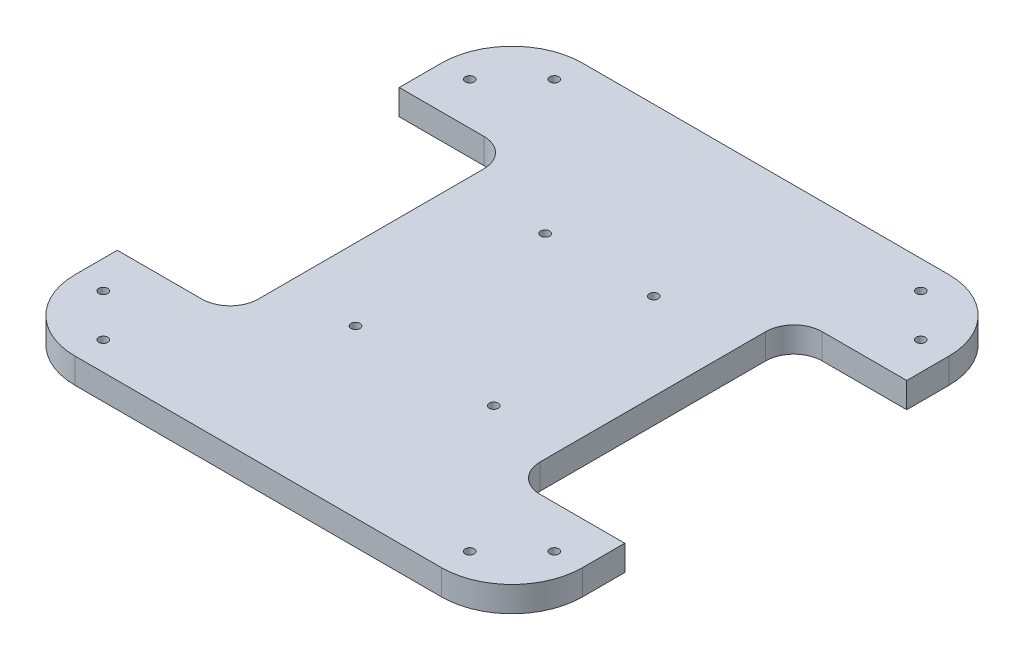
ISO-10303-21;
HEADER;
FILE_DESCRIPTION(('STEP AP214'),'2;1');
FILE_NAME('part.step','',(''),(''),'','','');
FILE_SCHEMA(('AUTOMOTIVE_DESIGN { 1 0 10303 214 1 1 1 1 }'));
ENDSEC;
DATA;
#1=APPLICATION_CONTEXT('core data for automotive mechanical design processes');
#2=APPLICATION_PROTOCOL_DEFINITION('international standard','automotive_design',2000,#1);
#3=PRODUCT_CONTEXT('',#1,'mechanical');
#4=PRODUCT('Part','Part','',(#3));
#5=PRODUCT_RELATED_PRODUCT_CATEGORY('part','',(#4));
#6=PRODUCT_DEFINITION_FORMATION('','',#4);
#7=PRODUCT_DEFINITION_CONTEXT('part definition',#1,'design');
#8=PRODUCT_DEFINITION('design','',#6,#7);
#9=PRODUCT_DEFINITION_SHAPE('','',#8);
#10=(LENGTH_UNIT() NAMED_UNIT(*) SI_UNIT(.MILLI.,.METRE.));
#11=(NAMED_UNIT(*) PLANE_ANGLE_UNIT() SI_UNIT($,.RADIAN.));
#12=(NAMED_UNIT(*) SI_UNIT($,.STERADIAN.) SOLID_ANGLE_UNIT());
#13=UNCERTAINTY_MEASURE_WITH_UNIT(LENGTH_MEASURE(1.E-05),#10,'distance_accuracy_value','');
#14=(GEOMETRIC_REPRESENTATION_CONTEXT(3) GLOBAL_UNCERTAINTY_ASSIGNED_CONTEXT((#13)) GLOBAL_UNIT_ASSIGNED_CONTEXT((#10,
#11,#12)) REPRESENTATION_CONTEXT('',''));
#15=CARTESIAN_POINT('',(0.,0.,0.));
#16=DIRECTION('',(0.,0.,1.));
#17=DIRECTION('',(1.,0.,0.));
#18=AXIS2_PLACEMENT_3D('',#15,#16,#17);
#19=CARTESIAN_POINT('',(-90.,9.,65.));
#20=DIRECTION('',(1.,0.,0.));
#21=DIRECTION('',(0.,0.,-1.));
#22=AXIS2_PLACEMENT_3D('',#19,#20,#21);
#23=PLANE('',#22);
#24=DIRECTION('',(0.,0.,1.));
#25=VECTOR('',#24,1.);
#26=CARTESIAN_POINT('',(-90.,0.,65.));
#27=LINE('',#26,#25);
#28=CARTESIAN_POINT('',(-90.,0.,-64.9999999999999));
#29=VERTEX_POINT('',#28);
#30=CARTESIAN_POINT('',(-90.,0.,-50.));
#31=VERTEX_POINT('',#30);
#32=EDGE_CURVE('E198',#29,#31,#27,.T.);
#33=ORIENTED_EDGE('',*,*,#32,.T.);
#34=DIRECTION('',(0.,1.,0.));
#35=VECTOR('',#34,1.);
#36=CARTESIAN_POINT('',(-90.,0.,-50.));
#37=LINE('',#36,#35);
#38=CARTESIAN_POINT('',(-90.,9.,-50.));
#39=VERTEX_POINT('',#38);
#40=EDGE_CURVE('E189',#31,#39,#37,.T.);
#41=ORIENTED_EDGE('',*,*,#40,.T.);
#42=DIRECTION('',(0.,0.,1.));
#43=VECTOR('',#42,1.);
#44=CARTESIAN_POINT('',(-90.,9.,65.));
#45=LINE('',#44,#43);
#46=CARTESIAN_POINT('',(-90.,9.,-64.9999999999999));
#47=VERTEX_POINT('',#46);
#48=EDGE_CURVE('E397',#47,#39,#45,.T.);
#49=ORIENTED_EDGE('',*,*,#48,.F.);
#50=DIRECTION('',(0.,-1.,0.));
#51=VECTOR('',#50,1.);
#52=CARTESIAN_POINT('',(-90.,9.,-64.9999999999999));
#53=LINE('',#52,#51);
#54=EDGE_CURVE('E231',#47,#29,#53,.T.);
#55=ORIENTED_EDGE('',*,*,#54,.T.);
#56=EDGE_LOOP('',(#33,#41,#49,#55));
#57=FACE_BOUND('',#56,.T.);
#58=ADVANCED_FACE('F39',(#57),#23,.F.);
#59=CARTESIAN_POINT('',(90.,9.,65.));
#60=DIRECTION('',(-1.,0.,0.));
#61=DIRECTION('',(0.,0.,1.));
#62=AXIS2_PLACEMENT_3D('',#59,#60,#61);
#63=PLANE('',#62);
#64=DIRECTION('',(0.,0.,-1.));
#65=VECTOR('',#64,1.);
#66=CARTESIAN_POINT('',(90.,0.,65.));
#67=LINE('',#66,#65);
#68=CARTESIAN_POINT('',(90.,0.,65.));
#69=VERTEX_POINT('',#68);
#70=CARTESIAN_POINT('',(90.,0.,49.9999999999999));
#71=VERTEX_POINT('',#70);
#72=EDGE_CURVE('E212',#69,#71,#67,.T.);
#73=ORIENTED_EDGE('',*,*,#72,.T.);
#74=DIRECTION('',(0.,1.,0.));
#75=VECTOR('',#74,1.);
#76=CARTESIAN_POINT('',(90.,0.,49.9999999999999));
#77=LINE('',#76,#75);
#78=CARTESIAN_POINT('',(90.,9.,49.9999999999999));
#79=VERTEX_POINT('',#78);
#80=EDGE_CURVE('E302',#71,#79,#77,.T.);
#81=ORIENTED_EDGE('',*,*,#80,.T.);
#82=DIRECTION('',(0.,0.,-1.));
#83=VECTOR('',#82,1.);
#84=CARTESIAN_POINT('',(90.,9.,65.));
#85=LINE('',#84,#83);
#86=CARTESIAN_POINT('',(90.,9.,65.));
#87=VERTEX_POINT('',#86);
#88=EDGE_CURVE('E220',#87,#79,#85,.T.);
#89=ORIENTED_EDGE('',*,*,#88,.F.);
#90=DIRECTION('',(0.,-1.,0.));
#91=VECTOR('',#90,1.);
#92=CARTESIAN_POINT('',(90.,9.,65.));
#93=LINE('',#92,#91);
#94=EDGE_CURVE('E219',#87,#69,#93,.T.);
#95=ORIENTED_EDGE('',*,*,#94,.T.);
#96=EDGE_LOOP('',(#73,#81,#89,#95));
#97=FACE_BOUND('',#96,.T.);
#98=ADVANCED_FACE('F456',(#97),#63,.F.);
#99=CARTESIAN_POINT('',(64.9999999999998,9.,-64.9999999999999));
#100=DIRECTION('',(0.,-1.,0.));
#101=DIRECTION('',(0.,0.,-1.));
#102=AXIS2_PLACEMENT_3D('',#99,#100,#101);
#103=CYLINDRICAL_SURFACE('',#102,25.0000000000002);
#104=CARTESIAN_POINT('',(64.9999999999998,0.,-64.9999999999999));
#105=DIRECTION('',(0.,1.,0.));
#106=DIRECTION('',(0.,0.,-1.));
#107=AXIS2_PLACEMENT_3D('',#104,#105,#106);
#108=CIRCLE('',#107,25.0000000000002);
#109=CARTESIAN_POINT('',(90.,0.,-64.9999999999999));
#110=VERTEX_POINT('',#109);
#111=CARTESIAN_POINT('',(64.9999999999998,0.,-90.0000000000001));
#112=VERTEX_POINT('',#111);
#113=EDGE_CURVE('E388',#110,#112,#108,.T.);
#114=ORIENTED_EDGE('',*,*,#113,.T.);
#115=DIRECTION('',(0.,-1.,0.));
#116=VECTOR('',#115,1.);
#117=CARTESIAN_POINT('',(64.9999999999998,9.,-90.0000000000001));
#118=LINE('',#117,#116);
#119=CARTESIAN_POINT('',(64.9999999999998,9.,-90.0000000000001));
#120=VERTEX_POINT('',#119);
#121=EDGE_CURVE('E237',#120,#112,#118,.T.);
#122=ORIENTED_EDGE('',*,*,#121,.F.);
#123=CARTESIAN_POINT('',(64.9999999999998,9.,-64.9999999999999));
#124=DIRECTION('',(0.,1.,0.));
#125=DIRECTION('',(0.,0.,-1.));
#126=AXIS2_PLACEMENT_3D('',#123,#124,#125);
#127=CIRCLE('',#126,25.0000000000002);
#128=CARTESIAN_POINT('',(90.,9.,-64.9999999999999));
#129=VERTEX_POINT('',#128);
#130=EDGE_CURVE('E215',#129,#120,#127,.T.);
#131=ORIENTED_EDGE('',*,*,#130,.F.);
#132=DIRECTION('',(0.,-1.,0.));
#133=VECTOR('',#132,1.);
#134=CARTESIAN_POINT('',(90.,9.,-64.9999999999999));
#135=LINE('',#134,#133);
#136=EDGE_CURVE('E216',#129,#110,#135,.T.);
#137=ORIENTED_EDGE('',*,*,#136,.T.);
#138=EDGE_LOOP('',(#114,#122,#131,#137));
#139=FACE_BOUND('',#138,.T.);
#140=ADVANCED_FACE('F426',(#139),#103,.T.);
#141=CARTESIAN_POINT('',(-64.9999999999998,9.,-90.0000000000001));
#142=DIRECTION('',(0.,0.,1.));
#143=DIRECTION('',(1.,0.,0.));
#144=AXIS2_PLACEMENT_3D('',#141,#142,#143);
#145=PLANE('',#144);
#146=DIRECTION('',(-1.,0.,0.));
#147=VECTOR('',#146,1.);
#148=CARTESIAN_POINT('',(-64.9999999999998,0.,-90.0000000000001));
#149=LINE('',#148,#147);
#150=CARTESIAN_POINT('',(-64.9999999999998,0.,-90.0000000000001));
#151=VERTEX_POINT('',#150);
#152=EDGE_CURVE('E202',#112,#151,#149,.T.);
#153=ORIENTED_EDGE('',*,*,#152,.T.);
#154=DIRECTION('',(0.,-1.,0.));
#155=VECTOR('',#154,1.);
#156=CARTESIAN_POINT('',(-64.9999999999998,9.,-90.0000000000001));
#157=LINE('',#156,#155);
#158=CARTESIAN_POINT('',(-64.9999999999998,9.,-90.0000000000001));
#159=VERTEX_POINT('',#158);
#160=EDGE_CURVE('E234',#159,#151,#157,.T.);
#161=ORIENTED_EDGE('',*,*,#160,.F.);
#162=DIRECTION('',(-1.,0.,0.));
#163=VECTOR('',#162,1.);
#164=CARTESIAN_POINT('',(-64.9999999999998,9.,-90.0000000000001));
#165=LINE('',#164,#163);
#166=EDGE_CURVE('E393',#120,#159,#165,.T.);
#167=ORIENTED_EDGE('',*,*,#166,.F.);
#168=ORIENTED_EDGE('',*,*,#121,.T.);
#169=EDGE_LOOP('',(#153,#161,#167,#168));
#170=FACE_BOUND('',#169,.T.);
#171=ADVANCED_FACE('F411',(#170),#145,.F.);
#172=CARTESIAN_POINT('',(-64.9999999999998,9.,-64.9999999999999));
#173=DIRECTION('',(0.,-1.,0.));
#174=DIRECTION('',(0.,0.,-1.));
#175=AXIS2_PLACEMENT_3D('',#172,#173,#174);
#176=CYLINDRICAL_SURFACE('',#175,25.0000000000002);
#177=CARTESIAN_POINT('',(-64.9999999999998,0.,-64.9999999999999));
#178=DIRECTION('',(0.,1.,0.));
#179=DIRECTION('',(0.,0.,-1.));
#180=AXIS2_PLACEMENT_3D('',#177,#178,#179);
#181=CIRCLE('',#180,25.0000000000002);
#182=EDGE_CURVE('E199',#151,#29,#181,.T.);
#183=ORIENTED_EDGE('',*,*,#182,.T.);
#184=ORIENTED_EDGE('',*,*,#54,.F.);
#185=CARTESIAN_POINT('',(-64.9999999999998,9.,-64.9999999999999));
#186=DIRECTION('',(0.,1.,0.));
#187=DIRECTION('',(0.,0.,-1.));
#188=AXIS2_PLACEMENT_3D('',#185,#186,#187);
#189=CIRCLE('',#188,25.0000000000002);
#190=EDGE_CURVE('E395',#159,#47,#189,.T.);
#191=ORIENTED_EDGE('',*,*,#190,.F.);
#192=ORIENTED_EDGE('',*,*,#160,.T.);
#193=EDGE_LOOP('',(#183,#184,#191,#192));
#194=FACE_BOUND('',#193,.T.);
#195=ADVANCED_FACE('F417',(#194),#176,.T.);
#196=CARTESIAN_POINT('',(-90.,9.,50.));
#197=VERTEX_POINT('',#196);
#198=CARTESIAN_POINT('',(-90.,9.,65.));
#199=VERTEX_POINT('',#198);
#200=EDGE_CURVE('E188',#197,#199,#45,.T.);
#201=ORIENTED_EDGE('',*,*,#200,.F.);
#202=DIRECTION('',(0.,1.,0.));
#203=VECTOR('',#202,1.);
#204=CARTESIAN_POINT('',(-90.,0.,50.));
#205=LINE('',#204,#203);
#206=CARTESIAN_POINT('',(-90.,0.,50.));
#207=VERTEX_POINT('',#206);
#208=EDGE_CURVE('E175',#207,#197,#205,.T.);
#209=ORIENTED_EDGE('',*,*,#208,.F.);
#210=CARTESIAN_POINT('',(-90.,0.,65.));
#211=VERTEX_POINT('',#210);
#212=EDGE_CURVE('E186',#207,#211,#27,.T.);
#213=ORIENTED_EDGE('',*,*,#212,.T.);
#214=DIRECTION('',(0.,-1.,0.));
#215=VECTOR('',#214,1.);
#216=CARTESIAN_POINT('',(-90.,9.,65.));
#217=LINE('',#216,#215);
#218=EDGE_CURVE('E229',#199,#211,#217,.T.);
#219=ORIENTED_EDGE('',*,*,#218,.F.);
#220=EDGE_LOOP('',(#201,#209,#213,#219));
#221=FACE_BOUND('',#220,.T.);
#222=ADVANCED_FACE('F184',(#221),#23,.F.);
#223=CARTESIAN_POINT('',(-65.,9.,65.));
#224=DIRECTION('',(0.,-1.,0.));
#225=DIRECTION('',(0.,0.,-1.));
#226=AXIS2_PLACEMENT_3D('',#223,#224,#225);
#227=CYLINDRICAL_SURFACE('',#226,25.);
#228=CARTESIAN_POINT('',(-65.,0.,65.));
#229=DIRECTION('',(0.,1.,0.));
#230=DIRECTION('',(0.,0.,-1.));
#231=AXIS2_PLACEMENT_3D('',#228,#229,#230);
#232=CIRCLE('',#231,25.);
#233=CARTESIAN_POINT('',(-64.9999999999998,0.,90.0000000000001));
#234=VERTEX_POINT('',#233);
#235=EDGE_CURVE('E197',#211,#234,#232,.T.);
#236=ORIENTED_EDGE('',*,*,#235,.T.);
#237=DIRECTION('',(0.,-1.,0.));
#238=VECTOR('',#237,1.);
#239=CARTESIAN_POINT('',(-64.9999999999998,9.,90.0000000000001));
#240=LINE('',#239,#238);
#241=CARTESIAN_POINT('',(-64.9999999999998,9.,90.0000000000001));
#242=VERTEX_POINT('',#241);
#243=EDGE_CURVE('E226',#242,#234,#240,.T.);
#244=ORIENTED_EDGE('',*,*,#243,.F.);
#245=CARTESIAN_POINT('',(-65.,9.,65.));
#246=DIRECTION('',(0.,1.,0.));
#247=DIRECTION('',(0.,0.,-1.));
#248=AXIS2_PLACEMENT_3D('',#245,#246,#247);
#249=CIRCLE('',#248,25.);
#250=EDGE_CURVE('E399',#199,#242,#249,.T.);
#251=ORIENTED_EDGE('',*,*,#250,.F.);
#252=ORIENTED_EDGE('',*,*,#218,.T.);
#253=EDGE_LOOP('',(#236,#244,#251,#252));
#254=FACE_BOUND('',#253,.T.);
#255=ADVANCED_FACE('F468',(#254),#227,.T.);
#256=CARTESIAN_POINT('',(-64.9999999999998,9.,90.0000000000001));
#257=DIRECTION('',(0.,0.,-1.));
#258=DIRECTION('',(-1.,0.,0.));
#259=AXIS2_PLACEMENT_3D('',#256,#257,#258);
#260=PLANE('',#259);
#261=DIRECTION('',(1.,0.,0.));
#262=VECTOR('',#261,1.);
#263=CARTESIAN_POINT('',(-64.9999999999998,0.,90.0000000000001));
#264=LINE('',#263,#262);
#265=CARTESIAN_POINT('',(64.9999999999998,0.,90.0000000000001));
#266=VERTEX_POINT('',#265);
#267=EDGE_CURVE('E207',#234,#266,#264,.T.);
#268=ORIENTED_EDGE('',*,*,#267,.T.);
#269=DIRECTION('',(0.,-1.,0.));
#270=VECTOR('',#269,1.);
#271=CARTESIAN_POINT('',(64.9999999999998,9.,90.0000000000001));
#272=LINE('',#271,#270);
#273=CARTESIAN_POINT('',(64.9999999999998,9.,90.0000000000001));
#274=VERTEX_POINT('',#273);
#275=EDGE_CURVE('E223',#274,#266,#272,.T.);
#276=ORIENTED_EDGE('',*,*,#275,.F.);
#277=DIRECTION('',(1.,0.,0.));
#278=VECTOR('',#277,1.);
#279=CARTESIAN_POINT('',(-64.9999999999998,9.,90.0000000000001));
#280=LINE('',#279,#278);
#281=EDGE_CURVE('E401',#242,#274,#280,.T.);
#282=ORIENTED_EDGE('',*,*,#281,.F.);
#283=ORIENTED_EDGE('',*,*,#243,.T.);
#284=EDGE_LOOP('',(#268,#276,#282,#283));
#285=FACE_BOUND('',#284,.T.);
#286=ADVANCED_FACE('F464',(#285),#260,.F.);
#287=CARTESIAN_POINT('',(65.,9.,65.));
#288=DIRECTION('',(0.,-1.,0.));
#289=DIRECTION('',(0.,0.,-1.));
#290=AXIS2_PLACEMENT_3D('',#287,#288,#289);
#291=CYLINDRICAL_SURFACE('',#290,25.);
#292=CARTESIAN_POINT('',(65.,0.,65.));
#293=DIRECTION('',(0.,1.,0.));
#294=DIRECTION('',(0.,0.,-1.));
#295=AXIS2_PLACEMENT_3D('',#292,#293,#294);
#296=CIRCLE('',#295,25.);
#297=EDGE_CURVE('E209',#266,#69,#296,.T.);
#298=ORIENTED_EDGE('',*,*,#297,.T.);
#299=ORIENTED_EDGE('',*,*,#94,.F.);
#300=CARTESIAN_POINT('',(65.,9.,65.));
#301=DIRECTION('',(0.,1.,0.));
#302=DIRECTION('',(0.,0.,-1.));
#303=AXIS2_PLACEMENT_3D('',#300,#301,#302);
#304=CIRCLE('',#303,25.);
#305=EDGE_CURVE('E403',#274,#87,#304,.T.);
#306=ORIENTED_EDGE('',*,*,#305,.F.);
#307=ORIENTED_EDGE('',*,*,#275,.T.);
#308=EDGE_LOOP('',(#298,#299,#306,#307));
#309=FACE_BOUND('',#308,.T.);
#310=ADVANCED_FACE('F460',(#309),#291,.T.);
#311=CARTESIAN_POINT('',(90.,9.,-49.9999999999999));
#312=VERTEX_POINT('',#311);
#313=EDGE_CURVE('E405',#312,#129,#85,.T.);
#314=ORIENTED_EDGE('',*,*,#313,.F.);
#315=DIRECTION('',(0.,1.,0.));
#316=VECTOR('',#315,1.);
#317=CARTESIAN_POINT('',(90.,0.,-49.9999999999999));
#318=LINE('',#317,#316);
#319=CARTESIAN_POINT('',(90.,0.,-49.9999999999999));
#320=VERTEX_POINT('',#319);
#321=EDGE_CURVE('E299',#320,#312,#318,.T.);
#322=ORIENTED_EDGE('',*,*,#321,.F.);
#323=EDGE_CURVE('E211',#320,#110,#67,.T.);
#324=ORIENTED_EDGE('',*,*,#323,.T.);
#325=ORIENTED_EDGE('',*,*,#136,.F.);
#326=EDGE_LOOP('',(#314,#322,#324,#325));
#327=FACE_BOUND('',#326,.T.);
#328=ADVANCED_FACE('F431',(#327),#63,.F.);
#329=CARTESIAN_POINT('',(64.9999999999998,9.,-64.9999999999999));
#330=DIRECTION('',(0.,-1.,0.));
#331=DIRECTION('',(0.,0.,-1.));
#332=AXIS2_PLACEMENT_3D('',#329,#330,#331);
#333=PLANE('',#332);
#334=CARTESIAN_POINT('',(-24.5,9.,31.0000000000001));
#335=DIRECTION('',(0.,1.,0.));
#336=DIRECTION('',(0.,0.,1.));
#337=AXIS2_PLACEMENT_3D('',#334,#335,#336);
#338=CIRCLE('',#337,1.6);
#339=CARTESIAN_POINT('',(-24.5,9.,32.6000000000001));
#340=VERTEX_POINT('',#339);
#341=EDGE_CURVE('E323',#340,#340,#338,.T.);
#342=ORIENTED_EDGE('',*,*,#341,.F.);
#343=EDGE_LOOP('',(#342));
#344=FACE_BOUND('',#343,.T.);
#345=CARTESIAN_POINT('',(19.25,9.,-30.9999999999999));
#346=DIRECTION('',(0.,1.,0.));
#347=DIRECTION('',(0.,0.,1.));
#348=AXIS2_PLACEMENT_3D('',#345,#346,#347);
#349=CIRCLE('',#348,1.6);
#350=CARTESIAN_POINT('',(19.25,9.,-29.3999999999999));
#351=VERTEX_POINT('',#350);
#352=EDGE_CURVE('E327',#351,#351,#349,.T.);
#353=ORIENTED_EDGE('',*,*,#352,.F.);
#354=EDGE_LOOP('',(#353));
#355=FACE_BOUND('',#354,.T.);
#356=CARTESIAN_POINT('',(-19.25,9.,-30.9999999999999));
#357=DIRECTION('',(0.,1.,0.));
#358=DIRECTION('',(0.,0.,1.));
#359=AXIS2_PLACEMENT_3D('',#356,#357,#358);
#360=CIRCLE('',#359,1.6);
#361=CARTESIAN_POINT('',(-19.25,9.,-29.3999999999999));
#362=VERTEX_POINT('',#361);
#363=EDGE_CURVE('E338',#362,#362,#360,.T.);
#364=ORIENTED_EDGE('',*,*,#363,.F.);
#365=EDGE_LOOP('',(#364));
#366=FACE_BOUND('',#365,.T.);
#367=CARTESIAN_POINT('',(24.5,9.,31.0000000000001));
#368=DIRECTION('',(0.,1.,0.));
#369=DIRECTION('',(0.,0.,1.));
#370=AXIS2_PLACEMENT_3D('',#367,#368,#369);
#371=CIRCLE('',#370,1.6);
#372=CARTESIAN_POINT('',(24.5,9.,32.6000000000001));
#373=VERTEX_POINT('',#372);
#374=EDGE_CURVE('E326',#373,#373,#371,.T.);
#375=ORIENTED_EDGE('',*,*,#374,.F.);
#376=EDGE_LOOP('',(#375));
#377=FACE_BOUND('',#376,.T.);
#378=CARTESIAN_POINT('',(64.9999999999998,9.,-79.9999999999999));
#379=DIRECTION('',(0.,1.,0.));
#380=DIRECTION('',(0.,0.,1.));
#381=AXIS2_PLACEMENT_3D('',#378,#379,#380);
#382=CIRCLE('',#381,1.60000000000001);
#383=CARTESIAN_POINT('',(64.9999999999998,9.,-78.3999999999999));
#384=VERTEX_POINT('',#383);
#385=EDGE_CURVE('E368',#384,#384,#382,.T.);
#386=ORIENTED_EDGE('',*,*,#385,.F.);
#387=EDGE_LOOP('',(#386));
#388=FACE_BOUND('',#387,.T.);
#389=CARTESIAN_POINT('',(79.9999999999998,9.,65.));
#390=DIRECTION('',(0.,1.,0.));
#391=DIRECTION('',(0.,0.,1.));
#392=AXIS2_PLACEMENT_3D('',#389,#390,#391);
#393=CIRCLE('',#392,1.60000000000001);
#394=CARTESIAN_POINT('',(79.9999999999998,9.,66.6));
#395=VERTEX_POINT('',#394);
#396=EDGE_CURVE('E361',#395,#395,#393,.T.);
#397=ORIENTED_EDGE('',*,*,#396,.F.);
#398=EDGE_LOOP('',(#397));
#399=FACE_BOUND('',#398,.T.);
#400=CARTESIAN_POINT('',(79.9999999999998,9.,-64.9999999999999));
#401=DIRECTION('',(0.,1.,0.));
#402=DIRECTION('',(0.,0.,1.));
#403=AXIS2_PLACEMENT_3D('',#400,#401,#402);
#404=CIRCLE('',#403,1.60000000000001);
#405=CARTESIAN_POINT('',(79.9999999999998,9.,-63.3999999999999));
#406=VERTEX_POINT('',#405);
#407=EDGE_CURVE('E380',#406,#406,#404,.T.);
#408=ORIENTED_EDGE('',*,*,#407,.F.);
#409=EDGE_LOOP('',(#408));
#410=FACE_BOUND('',#409,.T.);
#411=CARTESIAN_POINT('',(-79.9999999999998,9.,-64.9999999999999));
#412=DIRECTION('',(0.,1.,0.));
#413=DIRECTION('',(0.,0.,1.));
#414=AXIS2_PLACEMENT_3D('',#411,#412,#413);
#415=CIRCLE('',#414,1.60000000000001);
#416=CARTESIAN_POINT('',(-79.9999999999998,9.,-63.3999999999999));
#417=VERTEX_POINT('',#416);
#418=EDGE_CURVE('E373',#417,#417,#415,.T.);
#419=ORIENTED_EDGE('',*,*,#418,.F.);
#420=EDGE_LOOP('',(#419));
#421=FACE_BOUND('',#420,.T.);
#422=CARTESIAN_POINT('',(64.9999999999998,9.,80.));
#423=DIRECTION('',(0.,1.,0.));
#424=DIRECTION('',(0.,0.,1.));
#425=AXIS2_PLACEMENT_3D('',#422,#423,#424);
#426=CIRCLE('',#425,1.60000000000001);
#427=CARTESIAN_POINT('',(64.9999999999998,9.,81.6));
#428=VERTEX_POINT('',#427);
#429=EDGE_CURVE('E343',#428,#428,#426,.T.);
#430=ORIENTED_EDGE('',*,*,#429,.F.);
#431=EDGE_LOOP('',(#430));
#432=FACE_BOUND('',#431,.T.);
#433=CARTESIAN_POINT('',(-64.9999999999997,9.,80.));
#434=DIRECTION('',(0.,1.,0.));
#435=DIRECTION('',(0.,0.,1.));
#436=AXIS2_PLACEMENT_3D('',#433,#434,#435);
#437=CIRCLE('',#436,1.60000000000001);
#438=CARTESIAN_POINT('',(-64.9999999999997,9.,81.6));
#439=VERTEX_POINT('',#438);
#440=EDGE_CURVE('E350',#439,#439,#437,.T.);
#441=ORIENTED_EDGE('',*,*,#440,.F.);
#442=EDGE_LOOP('',(#441));
#443=FACE_BOUND('',#442,.T.);
#444=CARTESIAN_POINT('',(-79.9999999999997,9.,65.));
#445=DIRECTION('',(0.,1.,0.));
#446=DIRECTION('',(0.,0.,1.));
#447=AXIS2_PLACEMENT_3D('',#444,#445,#446);
#448=CIRCLE('',#447,1.60000000000001);
#449=CARTESIAN_POINT('',(-79.9999999999997,9.,66.6));
#450=VERTEX_POINT('',#449);
#451=EDGE_CURVE('E356',#450,#450,#448,.T.);
#452=ORIENTED_EDGE('',*,*,#451,.F.);
#453=EDGE_LOOP('',(#452));
#454=FACE_BOUND('',#453,.T.);
#455=CARTESIAN_POINT('',(-64.9999999999998,9.,-79.9999999999999));
#456=DIRECTION('',(0.,1.,0.));
#457=DIRECTION('',(0.,0.,1.));
#458=AXIS2_PLACEMENT_3D('',#455,#456,#457);
#459=CIRCLE('',#458,1.60000000000001);
#460=CARTESIAN_POINT('',(-64.9999999999998,9.,-78.3999999999999));
#461=VERTEX_POINT('',#460);
#462=EDGE_CURVE('E376',#461,#461,#459,.T.);
#463=ORIENTED_EDGE('',*,*,#462,.F.);
#464=EDGE_LOOP('',(#463));
#465=FACE_BOUND('',#464,.T.);
#466=ORIENTED_EDGE('',*,*,#48,.T.);
#467=DIRECTION('',(-1.,0.,0.));
#468=VECTOR('',#467,1.);
#469=CARTESIAN_POINT('',(-90.,9.,-50.));
#470=LINE('',#469,#468);
#471=CARTESIAN_POINT('',(-60.,9.,-50.));
#472=VERTEX_POINT('',#471);
#473=EDGE_CURVE('E180',#472,#39,#470,.T.);
#474=ORIENTED_EDGE('',*,*,#473,.F.);
#475=CARTESIAN_POINT('',(-60.,9.,-40.));
#476=DIRECTION('',(0.,-1.,0.));
#477=DIRECTION('',(0.,0.,-1.));
#478=AXIS2_PLACEMENT_3D('',#475,#476,#477);
#479=CIRCLE('',#478,10.);
#480=CARTESIAN_POINT('',(-50.,9.,-40.));
#481=VERTEX_POINT('',#480);
#482=EDGE_CURVE('E267',#472,#481,#479,.T.);
#483=ORIENTED_EDGE('',*,*,#482,.T.);
#484=DIRECTION('',(0.,0.,-1.));
#485=VECTOR('',#484,1.);
#486=CARTESIAN_POINT('',(-50.,9.,50.));
#487=LINE('',#486,#485);
#488=CARTESIAN_POINT('',(-50.,9.,40.));
#489=VERTEX_POINT('',#488);
#490=EDGE_CURVE('E287',#489,#481,#487,.T.);
#491=ORIENTED_EDGE('',*,*,#490,.F.);
#492=CARTESIAN_POINT('',(-60.,9.,40.));
#493=DIRECTION('',(0.,-1.,0.));
#494=DIRECTION('',(0.,0.,-1.));
#495=AXIS2_PLACEMENT_3D('',#492,#493,#494);
#496=CIRCLE('',#495,10.);
#497=CARTESIAN_POINT('',(-60.,9.,50.));
#498=VERTEX_POINT('',#497);
#499=EDGE_CURVE('E47',#489,#498,#496,.T.);
#500=ORIENTED_EDGE('',*,*,#499,.T.);
#501=DIRECTION('',(1.,0.,0.));
#502=VECTOR('',#501,1.);
#503=CARTESIAN_POINT('',(-90.,9.,50.));
#504=LINE('',#503,#502);
#505=EDGE_CURVE('E291',#197,#498,#504,.T.);
#506=ORIENTED_EDGE('',*,*,#505,.F.);
#507=ORIENTED_EDGE('',*,*,#200,.T.);
#508=ORIENTED_EDGE('',*,*,#250,.T.);
#509=ORIENTED_EDGE('',*,*,#281,.T.);
#510=ORIENTED_EDGE('',*,*,#305,.T.);
#511=ORIENTED_EDGE('',*,*,#88,.T.);
#512=DIRECTION('',(1.,0.,0.));
#513=VECTOR('',#512,1.);
#514=CARTESIAN_POINT('',(90.,9.,49.9999999999999));
#515=LINE('',#514,#513);
#516=CARTESIAN_POINT('',(60.,9.,50.));
#517=VERTEX_POINT('',#516);
#518=EDGE_CURVE('E305',#517,#79,#515,.T.);
#519=ORIENTED_EDGE('',*,*,#518,.F.);
#520=CARTESIAN_POINT('',(60.,9.,40.));
#521=DIRECTION('',(0.,-1.,0.));
#522=DIRECTION('',(0.,0.,-1.));
#523=AXIS2_PLACEMENT_3D('',#520,#521,#522);
#524=CIRCLE('',#523,10.);
#525=CARTESIAN_POINT('',(50.,9.,40.));
#526=VERTEX_POINT('',#525);
#527=EDGE_CURVE('E263',#517,#526,#524,.T.);
#528=ORIENTED_EDGE('',*,*,#527,.T.);
#529=DIRECTION('',(0.,0.,1.));
#530=VECTOR('',#529,1.);
#531=CARTESIAN_POINT('',(50.,9.,50.));
#532=LINE('',#531,#530);
#533=CARTESIAN_POINT('',(50.,9.,-40.));
#534=VERTEX_POINT('',#533);
#535=EDGE_CURVE('E307',#534,#526,#532,.T.);
#536=ORIENTED_EDGE('',*,*,#535,.F.);
#537=CARTESIAN_POINT('',(60.,9.,-40.));
#538=DIRECTION('',(0.,-1.,0.));
#539=DIRECTION('',(0.,0.,-1.));
#540=AXIS2_PLACEMENT_3D('',#537,#538,#539);
#541=CIRCLE('',#540,10.);
#542=CARTESIAN_POINT('',(60.,9.,-50.));
#543=VERTEX_POINT('',#542);
#544=EDGE_CURVE('E259',#534,#543,#541,.T.);
#545=ORIENTED_EDGE('',*,*,#544,.T.);
#546=DIRECTION('',(-1.,0.,0.));
#547=VECTOR('',#546,1.);
#548=CARTESIAN_POINT('',(90.,9.,-49.9999999999999));
#549=LINE('',#548,#547);
#550=EDGE_CURVE('E294',#312,#543,#549,.T.);
#551=ORIENTED_EDGE('',*,*,#550,.F.);
#552=ORIENTED_EDGE('',*,*,#313,.T.);
#553=ORIENTED_EDGE('',*,*,#130,.T.);
#554=ORIENTED_EDGE('',*,*,#166,.T.);
#555=ORIENTED_EDGE('',*,*,#190,.T.);
#556=EDGE_LOOP('',(#466,#474,#483,#491,#500,#506,#507,#508,#509,#510,#511,#519,#528,#536,#545,
#551,#552,#553,#554,#555));
#557=FACE_BOUND('',#556,.T.);
#558=ADVANCED_FACE('F286',(#344,#355,#366,#377,#388,#399,#410,#421,#432,#443,#454,#465,#557),
#333,.F.);
#559=CARTESIAN_POINT('',(64.9999999999998,0.,-64.9999999999999));
#560=DIRECTION('',(0.,-1.,0.));
#561=DIRECTION('',(0.,0.,-1.));
#562=AXIS2_PLACEMENT_3D('',#559,#560,#561);
#563=PLANE('',#562);
#564=DIRECTION('',(0.,0.,-1.));
#565=VECTOR('',#564,1.);
#566=CARTESIAN_POINT('',(-50.,0.,50.));
#567=LINE('',#566,#565);
#568=CARTESIAN_POINT('',(-50.,0.,40.));
#569=VERTEX_POINT('',#568);
#570=CARTESIAN_POINT('',(-50.,0.,-40.));
#571=VERTEX_POINT('',#570);
#572=EDGE_CURVE('E179',#569,#571,#567,.T.);
#573=ORIENTED_EDGE('',*,*,#572,.T.);
#574=CARTESIAN_POINT('',(-60.,0.,-40.));
#575=DIRECTION('',(0.,-1.,0.));
#576=DIRECTION('',(0.,0.,-1.));
#577=AXIS2_PLACEMENT_3D('',#574,#575,#576);
#578=CIRCLE('',#577,10.);
#579=CARTESIAN_POINT('',(-60.,0.,-50.));
#580=VERTEX_POINT('',#579);
#581=EDGE_CURVE('E269',#571,#580,#578,.F.);
#582=ORIENTED_EDGE('',*,*,#581,.T.);
#583=DIRECTION('',(-1.,0.,0.));
#584=VECTOR('',#583,1.);
#585=CARTESIAN_POINT('',(-90.,0.,-50.));
#586=LINE('',#585,#584);
#587=EDGE_CURVE('E190',#580,#31,#586,.T.);
#588=ORIENTED_EDGE('',*,*,#587,.T.);
#589=ORIENTED_EDGE('',*,*,#32,.F.);
#590=ORIENTED_EDGE('',*,*,#182,.F.);
#591=ORIENTED_EDGE('',*,*,#152,.F.);
#592=ORIENTED_EDGE('',*,*,#113,.F.);
#593=ORIENTED_EDGE('',*,*,#323,.F.);
#594=DIRECTION('',(-1.,0.,0.));
#595=VECTOR('',#594,1.);
#596=CARTESIAN_POINT('',(90.,0.,-49.9999999999999));
#597=LINE('',#596,#595);
#598=CARTESIAN_POINT('',(60.,0.,-50.));
#599=VERTEX_POINT('',#598);
#600=EDGE_CURVE('E308',#320,#599,#597,.T.);
#601=ORIENTED_EDGE('',*,*,#600,.T.);
#602=CARTESIAN_POINT('',(60.,0.,-40.));
#603=DIRECTION('',(0.,-1.,0.));
#604=DIRECTION('',(0.,0.,-1.));
#605=AXIS2_PLACEMENT_3D('',#602,#603,#604);
#606=CIRCLE('',#605,10.);
#607=CARTESIAN_POINT('',(50.,0.,-40.));
#608=VERTEX_POINT('',#607);
#609=EDGE_CURVE('E261',#599,#608,#606,.F.);
#610=ORIENTED_EDGE('',*,*,#609,.T.);
#611=DIRECTION('',(0.,0.,1.));
#612=VECTOR('',#611,1.);
#613=CARTESIAN_POINT('',(50.,0.,50.));
#614=LINE('',#613,#612);
#615=CARTESIAN_POINT('',(50.,0.,40.));
#616=VERTEX_POINT('',#615);
#617=EDGE_CURVE('E314',#608,#616,#614,.T.);
#618=ORIENTED_EDGE('',*,*,#617,.T.);
#619=CARTESIAN_POINT('',(60.,0.,40.));
#620=DIRECTION('',(0.,-1.,0.));
#621=DIRECTION('',(0.,0.,-1.));
#622=AXIS2_PLACEMENT_3D('',#619,#620,#621);
#623=CIRCLE('',#622,10.);
#624=CARTESIAN_POINT('',(60.,0.,50.));
#625=VERTEX_POINT('',#624);
#626=EDGE_CURVE('E265',#616,#625,#623,.F.);
#627=ORIENTED_EDGE('',*,*,#626,.T.);
#628=DIRECTION('',(1.,0.,0.));
#629=VECTOR('',#628,1.);
#630=CARTESIAN_POINT('',(90.,0.,49.9999999999999));
#631=LINE('',#630,#629);
#632=EDGE_CURVE('E301',#625,#71,#631,.T.);
#633=ORIENTED_EDGE('',*,*,#632,.T.);
#634=ORIENTED_EDGE('',*,*,#72,.F.);
#635=ORIENTED_EDGE('',*,*,#297,.F.);
#636=ORIENTED_EDGE('',*,*,#267,.F.);
#637=ORIENTED_EDGE('',*,*,#235,.F.);
#638=ORIENTED_EDGE('',*,*,#212,.F.);
#639=DIRECTION('',(1.,0.,0.));
#640=VECTOR('',#639,1.);
#641=CARTESIAN_POINT('',(-90.,0.,50.));
#642=LINE('',#641,#640);
#643=CARTESIAN_POINT('',(-60.,0.,50.));
#644=VERTEX_POINT('',#643);
#645=EDGE_CURVE('E172',#207,#644,#642,.T.);
#646=ORIENTED_EDGE('',*,*,#645,.T.);
#647=CARTESIAN_POINT('',(-60.,0.,40.));
#648=DIRECTION('',(0.,-1.,0.));
#649=DIRECTION('',(0.,0.,-1.));
#650=AXIS2_PLACEMENT_3D('',#647,#648,#649);
#651=CIRCLE('',#650,10.);
#652=EDGE_CURVE('E11',#644,#569,#651,.F.);
#653=ORIENTED_EDGE('',*,*,#652,.T.);
#654=EDGE_LOOP('',(#573,#582,#588,#589,#590,#591,#592,#593,#601,#610,#618,#627,#633,#634,#635,
#636,#637,#638,#646,#653));
#655=FACE_BOUND('',#654,.T.);
#656=CARTESIAN_POINT('',(-24.5,0.,31.0000000000001));
#657=DIRECTION('',(0.,1.,0.));
#658=DIRECTION('',(0.,0.,1.));
#659=AXIS2_PLACEMENT_3D('',#656,#657,#658);
#660=CIRCLE('',#659,1.6);
#661=CARTESIAN_POINT('',(-24.5,0.,32.6000000000001));
#662=VERTEX_POINT('',#661);
#663=EDGE_CURVE('E319',#662,#662,#660,.T.);
#664=ORIENTED_EDGE('',*,*,#663,.T.);
#665=EDGE_LOOP('',(#664));
#666=FACE_BOUND('',#665,.T.);
#667=CARTESIAN_POINT('',(19.25,0.,-30.9999999999999));
#668=DIRECTION('',(0.,1.,0.));
#669=DIRECTION('',(0.,0.,1.));
#670=AXIS2_PLACEMENT_3D('',#667,#668,#669);
#671=CIRCLE('',#670,1.6);
#672=CARTESIAN_POINT('',(19.25,0.,-29.3999999999999));
#673=VERTEX_POINT('',#672);
#674=EDGE_CURVE('E297',#673,#673,#671,.T.);
#675=ORIENTED_EDGE('',*,*,#674,.T.);
#676=EDGE_LOOP('',(#675));
#677=FACE_BOUND('',#676,.T.);
#678=CARTESIAN_POINT('',(-19.25,0.,-30.9999999999999));
#679=DIRECTION('',(0.,1.,0.));
#680=DIRECTION('',(0.,0.,1.));
#681=AXIS2_PLACEMENT_3D('',#678,#679,#680);
#682=CIRCLE('',#681,1.6);
#683=CARTESIAN_POINT('',(-19.25,0.,-29.3999999999999));
#684=VERTEX_POINT('',#683);
#685=EDGE_CURVE('E330',#684,#684,#682,.T.);
#686=ORIENTED_EDGE('',*,*,#685,.T.);
#687=EDGE_LOOP('',(#686));
#688=FACE_BOUND('',#687,.T.);
#689=CARTESIAN_POINT('',(24.5,0.,31.0000000000001));
#690=DIRECTION('',(0.,1.,0.));
#691=DIRECTION('',(0.,0.,1.));
#692=AXIS2_PLACEMENT_3D('',#689,#690,#691);
#693=CIRCLE('',#692,1.6);
#694=CARTESIAN_POINT('',(24.5,0.,32.6000000000001));
#695=VERTEX_POINT('',#694);
#696=EDGE_CURVE('E335',#695,#695,#693,.T.);
#697=ORIENTED_EDGE('',*,*,#696,.T.);
#698=EDGE_LOOP('',(#697));
#699=FACE_BOUND('',#698,.T.);
#700=CARTESIAN_POINT('',(64.9999999999998,0.,-79.9999999999999));
#701=DIRECTION('',(0.,1.,0.));
#702=DIRECTION('',(0.,0.,1.));
#703=AXIS2_PLACEMENT_3D('',#700,#701,#702);
#704=CIRCLE('',#703,1.60000000000001);
#705=CARTESIAN_POINT('',(64.9999999999998,0.,-78.3999999999999));
#706=VERTEX_POINT('',#705);
#707=EDGE_CURVE('E346',#706,#706,#704,.T.);
#708=ORIENTED_EDGE('',*,*,#707,.T.);
#709=EDGE_LOOP('',(#708));
#710=FACE_BOUND('',#709,.T.);
#711=CARTESIAN_POINT('',(79.9999999999998,0.,65.));
#712=DIRECTION('',(0.,1.,0.));
#713=DIRECTION('',(0.,0.,1.));
#714=AXIS2_PLACEMENT_3D('',#711,#712,#713);
#715=CIRCLE('',#714,1.60000000000001);
#716=CARTESIAN_POINT('',(79.9999999999998,0.,66.6));
#717=VERTEX_POINT('',#716);
#718=EDGE_CURVE('E365',#717,#717,#715,.T.);
#719=ORIENTED_EDGE('',*,*,#718,.T.);
#720=EDGE_LOOP('',(#719));
#721=FACE_BOUND('',#720,.T.);
#722=CARTESIAN_POINT('',(79.9999999999998,0.,-64.9999999999999));
#723=DIRECTION('',(0.,1.,0.));
#724=DIRECTION('',(0.,0.,1.));
#725=AXIS2_PLACEMENT_3D('',#722,#723,#724);
#726=CIRCLE('',#725,1.60000000000001);
#727=CARTESIAN_POINT('',(79.9999999999998,0.,-63.3999999999999));
#728=VERTEX_POINT('',#727);
#729=EDGE_CURVE('E364',#728,#728,#726,.T.);
#730=ORIENTED_EDGE('',*,*,#729,.T.);
#731=EDGE_LOOP('',(#730));
#732=FACE_BOUND('',#731,.T.);
#733=CARTESIAN_POINT('',(-79.9999999999998,0.,-64.9999999999999));
#734=DIRECTION('',(0.,1.,0.));
#735=DIRECTION('',(0.,0.,1.));
#736=AXIS2_PLACEMENT_3D('',#733,#734,#735);
#737=CIRCLE('',#736,1.60000000000001);
#738=CARTESIAN_POINT('',(-79.9999999999998,0.,-63.3999999999999));
#739=VERTEX_POINT('',#738);
#740=EDGE_CURVE('E377',#739,#739,#737,.T.);
#741=ORIENTED_EDGE('',*,*,#740,.T.);
#742=EDGE_LOOP('',(#741));
#743=FACE_BOUND('',#742,.T.);
#744=CARTESIAN_POINT('',(64.9999999999998,0.,80.));
#745=DIRECTION('',(0.,1.,0.));
#746=DIRECTION('',(0.,0.,1.));
#747=AXIS2_PLACEMENT_3D('',#744,#745,#746);
#748=CIRCLE('',#747,1.60000000000001);
#749=CARTESIAN_POINT('',(64.9999999999998,0.,81.6));
#750=VERTEX_POINT('',#749);
#751=EDGE_CURVE('E347',#750,#750,#748,.T.);
#752=ORIENTED_EDGE('',*,*,#751,.T.);
#753=EDGE_LOOP('',(#752));
#754=FACE_BOUND('',#753,.T.);
#755=CARTESIAN_POINT('',(-64.9999999999997,0.,80.));
#756=DIRECTION('',(0.,1.,0.));
#757=DIRECTION('',(0.,0.,1.));
#758=AXIS2_PLACEMENT_3D('',#755,#756,#757);
#759=CIRCLE('',#758,1.60000000000001);
#760=CARTESIAN_POINT('',(-64.9999999999997,0.,81.6));
#761=VERTEX_POINT('',#760);
#762=EDGE_CURVE('E353',#761,#761,#759,.T.);
#763=ORIENTED_EDGE('',*,*,#762,.T.);
#764=EDGE_LOOP('',(#763));
#765=FACE_BOUND('',#764,.T.);
#766=CARTESIAN_POINT('',(-79.9999999999997,0.,65.));
#767=DIRECTION('',(0.,1.,0.));
#768=DIRECTION('',(0.,0.,1.));
#769=AXIS2_PLACEMENT_3D('',#766,#767,#768);
#770=CIRCLE('',#769,1.60000000000001);
#771=CARTESIAN_POINT('',(-79.9999999999997,0.,66.6));
#772=VERTEX_POINT('',#771);
#773=EDGE_CURVE('E322',#772,#772,#770,.T.);
#774=ORIENTED_EDGE('',*,*,#773,.T.);
#775=EDGE_LOOP('',(#774));
#776=FACE_BOUND('',#775,.T.);
#777=CARTESIAN_POINT('',(-64.9999999999998,0.,-79.9999999999999));
#778=DIRECTION('',(0.,1.,0.));
#779=DIRECTION('',(0.,0.,1.));
#780=AXIS2_PLACEMENT_3D('',#777,#778,#779);
#781=CIRCLE('',#780,1.60000000000001);
#782=CARTESIAN_POINT('',(-64.9999999999998,0.,-78.3999999999999));
#783=VERTEX_POINT('',#782);
#784=EDGE_CURVE('E385',#783,#783,#781,.T.);
#785=ORIENTED_EDGE('',*,*,#784,.T.);
#786=EDGE_LOOP('',(#785));
#787=FACE_BOUND('',#786,.T.);
#788=ADVANCED_FACE('F194',(#655,#666,#677,#688,#699,#710,#721,#732,#743,#754,#765,#776,#787),
#563,.T.);
#789=CARTESIAN_POINT('',(-64.9999999999998,0.,-79.9999999999999));
#790=DIRECTION('',(0.,1.,0.));
#791=DIRECTION('',(0.,0.,1.));
#792=AXIS2_PLACEMENT_3D('',#789,#790,#791);
#793=CYLINDRICAL_SURFACE('',#792,1.60000000000001);
#794=ORIENTED_EDGE('',*,*,#784,.F.);
#795=EDGE_LOOP('',(#794));
#796=FACE_BOUND('',#795,.T.);
#797=ORIENTED_EDGE('',*,*,#462,.T.);
#798=EDGE_LOOP('',(#797));
#799=FACE_BOUND('',#798,.T.);
#800=ADVANCED_FACE('F669',(#796,#799),#793,.F.);
#801=CARTESIAN_POINT('',(-79.9999999999997,0.,65.));
#802=DIRECTION('',(0.,1.,0.));
#803=DIRECTION('',(0.,0.,1.));
#804=AXIS2_PLACEMENT_3D('',#801,#802,#803);
#805=CYLINDRICAL_SURFACE('',#804,1.60000000000001);
#806=ORIENTED_EDGE('',*,*,#773,.F.);
#807=EDGE_LOOP('',(#806));
#808=FACE_BOUND('',#807,.T.);
#809=ORIENTED_EDGE('',*,*,#451,.T.);
#810=EDGE_LOOP('',(#809));
#811=FACE_BOUND('',#810,.T.);
#812=ADVANCED_FACE('F660',(#808,#811),#805,.F.);
#813=CARTESIAN_POINT('',(-64.9999999999997,0.,80.));
#814=DIRECTION('',(0.,1.,0.));
#815=DIRECTION('',(0.,0.,1.));
#816=AXIS2_PLACEMENT_3D('',#813,#814,#815);
#817=CYLINDRICAL_SURFACE('',#816,1.60000000000001);
#818=ORIENTED_EDGE('',*,*,#762,.F.);
#819=EDGE_LOOP('',(#818));
#820=FACE_BOUND('',#819,.T.);
#821=ORIENTED_EDGE('',*,*,#440,.T.);
#822=EDGE_LOOP('',(#821));
#823=FACE_BOUND('',#822,.T.);
#824=ADVANCED_FACE('F651',(#820,#823),#817,.F.);
#825=CARTESIAN_POINT('',(64.9999999999998,0.,80.));
#826=DIRECTION('',(0.,1.,0.));
#827=DIRECTION('',(0.,0.,1.));
#828=AXIS2_PLACEMENT_3D('',#825,#826,#827);
#829=CYLINDRICAL_SURFACE('',#828,1.60000000000001);
#830=ORIENTED_EDGE('',*,*,#751,.F.);
#831=EDGE_LOOP('',(#830));
#832=FACE_BOUND('',#831,.T.);
#833=ORIENTED_EDGE('',*,*,#429,.T.);
#834=EDGE_LOOP('',(#833));
#835=FACE_BOUND('',#834,.T.);
#836=ADVANCED_FACE('F642',(#832,#835),#829,.F.);
#837=CARTESIAN_POINT('',(-79.9999999999998,0.,-64.9999999999999));
#838=DIRECTION('',(0.,1.,0.));
#839=DIRECTION('',(0.,0.,1.));
#840=AXIS2_PLACEMENT_3D('',#837,#838,#839);
#841=CYLINDRICAL_SURFACE('',#840,1.60000000000001);
#842=ORIENTED_EDGE('',*,*,#740,.F.);
#843=EDGE_LOOP('',(#842));
#844=FACE_BOUND('',#843,.T.);
#845=ORIENTED_EDGE('',*,*,#418,.T.);
#846=EDGE_LOOP('',(#845));
#847=FACE_BOUND('',#846,.T.);
#848=ADVANCED_FACE('F633',(#844,#847),#841,.F.);
#849=CARTESIAN_POINT('',(79.9999999999998,0.,-64.9999999999999));
#850=DIRECTION('',(0.,1.,0.));
#851=DIRECTION('',(0.,0.,1.));
#852=AXIS2_PLACEMENT_3D('',#849,#850,#851);
#853=CYLINDRICAL_SURFACE('',#852,1.60000000000001);
#854=ORIENTED_EDGE('',*,*,#729,.F.);
#855=EDGE_LOOP('',(#854));
#856=FACE_BOUND('',#855,.T.);
#857=ORIENTED_EDGE('',*,*,#407,.T.);
#858=EDGE_LOOP('',(#857));
#859=FACE_BOUND('',#858,.T.);
#860=ADVANCED_FACE('F624',(#856,#859),#853,.F.);
#861=CARTESIAN_POINT('',(79.9999999999998,0.,65.));
#862=DIRECTION('',(0.,1.,0.));
#863=DIRECTION('',(0.,0.,1.));
#864=AXIS2_PLACEMENT_3D('',#861,#862,#863);
#865=CYLINDRICAL_SURFACE('',#864,1.60000000000001);
#866=ORIENTED_EDGE('',*,*,#718,.F.);
#867=EDGE_LOOP('',(#866));
#868=FACE_BOUND('',#867,.T.);
#869=ORIENTED_EDGE('',*,*,#396,.T.);
#870=EDGE_LOOP('',(#869));
#871=FACE_BOUND('',#870,.T.);
#872=ADVANCED_FACE('F615',(#868,#871),#865,.F.);
#873=CARTESIAN_POINT('',(64.9999999999998,0.,-79.9999999999999));
#874=DIRECTION('',(0.,1.,0.));
#875=DIRECTION('',(0.,0.,1.));
#876=AXIS2_PLACEMENT_3D('',#873,#874,#875);
#877=CYLINDRICAL_SURFACE('',#876,1.60000000000001);
#878=ORIENTED_EDGE('',*,*,#707,.F.);
#879=EDGE_LOOP('',(#878));
#880=FACE_BOUND('',#879,.T.);
#881=ORIENTED_EDGE('',*,*,#385,.T.);
#882=EDGE_LOOP('',(#881));
#883=FACE_BOUND('',#882,.T.);
#884=ADVANCED_FACE('F606',(#880,#883),#877,.F.);
#885=CARTESIAN_POINT('',(24.5,0.,31.0000000000001));
#886=DIRECTION('',(0.,1.,0.));
#887=DIRECTION('',(0.,0.,1.));
#888=AXIS2_PLACEMENT_3D('',#885,#886,#887);
#889=CYLINDRICAL_SURFACE('',#888,1.6);
#890=ORIENTED_EDGE('',*,*,#696,.F.);
#891=EDGE_LOOP('',(#890));
#892=FACE_BOUND('',#891,.T.);
#893=ORIENTED_EDGE('',*,*,#374,.T.);
#894=EDGE_LOOP('',(#893));
#895=FACE_BOUND('',#894,.T.);
#896=ADVANCED_FACE('F597',(#892,#895),#889,.F.);
#897=CARTESIAN_POINT('',(-19.25,0.,-30.9999999999999));
#898=DIRECTION('',(0.,1.,0.));
#899=DIRECTION('',(0.,0.,1.));
#900=AXIS2_PLACEMENT_3D('',#897,#898,#899);
#901=CYLINDRICAL_SURFACE('',#900,1.6);
#902=ORIENTED_EDGE('',*,*,#685,.F.);
#903=EDGE_LOOP('',(#902));
#904=FACE_BOUND('',#903,.T.);
#905=ORIENTED_EDGE('',*,*,#363,.T.);
#906=EDGE_LOOP('',(#905));
#907=FACE_BOUND('',#906,.T.);
#908=ADVANCED_FACE('F588',(#904,#907),#901,.F.);
#909=CARTESIAN_POINT('',(19.25,0.,-30.9999999999999));
#910=DIRECTION('',(0.,1.,0.));
#911=DIRECTION('',(0.,0.,1.));
#912=AXIS2_PLACEMENT_3D('',#909,#910,#911);
#913=CYLINDRICAL_SURFACE('',#912,1.6);
#914=ORIENTED_EDGE('',*,*,#674,.F.);
#915=EDGE_LOOP('',(#914));
#916=FACE_BOUND('',#915,.T.);
#917=ORIENTED_EDGE('',*,*,#352,.T.);
#918=EDGE_LOOP('',(#917));
#919=FACE_BOUND('',#918,.T.);
#920=ADVANCED_FACE('F579',(#916,#919),#913,.F.);
#921=CARTESIAN_POINT('',(-24.5,0.,31.0000000000001));
#922=DIRECTION('',(0.,1.,0.));
#923=DIRECTION('',(0.,0.,1.));
#924=AXIS2_PLACEMENT_3D('',#921,#922,#923);
#925=CYLINDRICAL_SURFACE('',#924,1.6);
#926=ORIENTED_EDGE('',*,*,#663,.F.);
#927=EDGE_LOOP('',(#926));
#928=FACE_BOUND('',#927,.T.);
#929=ORIENTED_EDGE('',*,*,#341,.T.);
#930=EDGE_LOOP('',(#929));
#931=FACE_BOUND('',#930,.T.);
#932=ADVANCED_FACE('F561',(#928,#931),#925,.F.);
#933=CARTESIAN_POINT('',(90.,0.,49.9999999999999));
#934=DIRECTION('',(0.,0.,1.));
#935=DIRECTION('',(1.,0.,0.));
#936=AXIS2_PLACEMENT_3D('',#933,#934,#935);
#937=PLANE('',#936);
#938=ORIENTED_EDGE('',*,*,#632,.F.);
#939=DIRECTION('',(0.,1.,0.));
#940=VECTOR('',#939,1.);
#941=CARTESIAN_POINT('',(60.,9.,50.));
#942=LINE('',#941,#940);
#943=EDGE_CURVE('E247',#625,#517,#942,.T.);
#944=ORIENTED_EDGE('',*,*,#943,.T.);
#945=ORIENTED_EDGE('',*,*,#518,.T.);
#946=ORIENTED_EDGE('',*,*,#80,.F.);
#947=EDGE_LOOP('',(#938,#944,#945,#946));
#948=FACE_BOUND('',#947,.T.);
#949=ADVANCED_FACE('F450',(#948),#937,.F.);
#950=CARTESIAN_POINT('',(50.,0.,50.));
#951=DIRECTION('',(-1.,0.,0.));
#952=DIRECTION('',(0.,0.,1.));
#953=AXIS2_PLACEMENT_3D('',#950,#951,#952);
#954=PLANE('',#953);
#955=ORIENTED_EDGE('',*,*,#617,.F.);
#956=DIRECTION('',(0.,1.,0.));
#957=VECTOR('',#956,1.);
#958=CARTESIAN_POINT('',(50.,9.,-40.));
#959=LINE('',#958,#957);
#960=EDGE_CURVE('E242',#608,#534,#959,.T.);
#961=ORIENTED_EDGE('',*,*,#960,.T.);
#962=ORIENTED_EDGE('',*,*,#535,.T.);
#963=DIRECTION('',(0.,1.,0.));
#964=VECTOR('',#963,1.);
#965=CARTESIAN_POINT('',(50.,0.,40.));
#966=LINE('',#965,#964);
#967=EDGE_CURVE('E240',#526,#616,#966,.F.);
#968=ORIENTED_EDGE('',*,*,#967,.T.);
#969=EDGE_LOOP('',(#955,#961,#962,#968));
#970=FACE_BOUND('',#969,.T.);
#971=ADVANCED_FACE('F441',(#970),#954,.F.);
#972=CARTESIAN_POINT('',(90.,0.,-49.9999999999999));
#973=DIRECTION('',(0.,0.,-1.));
#974=DIRECTION('',(-1.,0.,0.));
#975=AXIS2_PLACEMENT_3D('',#972,#973,#974);
#976=PLANE('',#975);
#977=ORIENTED_EDGE('',*,*,#550,.T.);
#978=DIRECTION('',(0.,1.,0.));
#979=VECTOR('',#978,1.);
#980=CARTESIAN_POINT('',(60.,0.,-50.));
#981=LINE('',#980,#979);
#982=EDGE_CURVE('E245',#543,#599,#981,.F.);
#983=ORIENTED_EDGE('',*,*,#982,.T.);
#984=ORIENTED_EDGE('',*,*,#600,.F.);
#985=ORIENTED_EDGE('',*,*,#321,.T.);
#986=EDGE_LOOP('',(#977,#983,#984,#985));
#987=FACE_BOUND('',#986,.T.);
#988=ADVANCED_FACE('F433',(#987),#976,.F.);
#989=CARTESIAN_POINT('',(-90.,0.,-50.));
#990=DIRECTION('',(0.,0.,-1.));
#991=DIRECTION('',(-1.,0.,0.));
#992=AXIS2_PLACEMENT_3D('',#989,#990,#991);
#993=PLANE('',#992);
#994=ORIENTED_EDGE('',*,*,#587,.F.);
#995=DIRECTION('',(0.,1.,0.));
#996=VECTOR('',#995,1.);
#997=CARTESIAN_POINT('',(-60.,9.,-50.));
#998=LINE('',#997,#996);
#999=EDGE_CURVE('E250',#580,#472,#998,.T.);
#1000=ORIENTED_EDGE('',*,*,#999,.T.);
#1001=ORIENTED_EDGE('',*,*,#473,.T.);
#1002=ORIENTED_EDGE('',*,*,#40,.F.);
#1003=EDGE_LOOP('',(#994,#1000,#1001,#1002));
#1004=FACE_BOUND('',#1003,.T.);
#1005=ADVANCED_FACE('F279',(#1004),#993,.F.);
#1006=CARTESIAN_POINT('',(-50.,0.,50.));
#1007=DIRECTION('',(1.,0.,0.));
#1008=DIRECTION('',(0.,0.,-1.));
#1009=AXIS2_PLACEMENT_3D('',#1006,#1007,#1008);
#1010=PLANE('',#1009);
#1011=ORIENTED_EDGE('',*,*,#490,.T.);
#1012=DIRECTION('',(0.,1.,0.));
#1013=VECTOR('',#1012,1.);
#1014=CARTESIAN_POINT('',(-50.,0.,-40.));
#1015=LINE('',#1014,#1013);
#1016=EDGE_CURVE('E256',#481,#571,#1015,.F.);
#1017=ORIENTED_EDGE('',*,*,#1016,.T.);
#1018=ORIENTED_EDGE('',*,*,#572,.F.);
#1019=DIRECTION('',(0.,1.,0.));
#1020=VECTOR('',#1019,1.);
#1021=CARTESIAN_POINT('',(-50.,9.,40.));
#1022=LINE('',#1021,#1020);
#1023=EDGE_CURVE('E253',#569,#489,#1022,.T.);
#1024=ORIENTED_EDGE('',*,*,#1023,.T.);
#1025=EDGE_LOOP('',(#1011,#1017,#1018,#1024));
#1026=FACE_BOUND('',#1025,.T.);
#1027=ADVANCED_FACE('F289',(#1026),#1010,.F.);
#1028=CARTESIAN_POINT('',(-90.,0.,50.));
#1029=DIRECTION('',(0.,0.,1.));
#1030=DIRECTION('',(1.,0.,0.));
#1031=AXIS2_PLACEMENT_3D('',#1028,#1029,#1030);
#1032=PLANE('',#1031);
#1033=ORIENTED_EDGE('',*,*,#505,.T.);
#1034=DIRECTION('',(0.,1.,0.));
#1035=VECTOR('',#1034,1.);
#1036=CARTESIAN_POINT('',(-60.,0.,50.));
#1037=LINE('',#1036,#1035);
#1038=EDGE_CURVE('E54',#498,#644,#1037,.F.);
#1039=ORIENTED_EDGE('',*,*,#1038,.T.);
#1040=ORIENTED_EDGE('',*,*,#645,.F.);
#1041=ORIENTED_EDGE('',*,*,#208,.T.);
#1042=EDGE_LOOP('',(#1033,#1039,#1040,#1041));
#1043=FACE_BOUND('',#1042,.T.);
#1044=ADVANCED_FACE('F174',(#1043),#1032,.F.);
#1045=CARTESIAN_POINT('',(60.,0.,-40.));
#1046=DIRECTION('',(0.,-1.,0.));
#1047=DIRECTION('',(0.,0.,-1.));
#1048=AXIS2_PLACEMENT_3D('',#1045,#1046,#1047);
#1049=CYLINDRICAL_SURFACE('',#1048,10.);
#1050=ORIENTED_EDGE('',*,*,#609,.F.);
#1051=ORIENTED_EDGE('',*,*,#982,.F.);
#1052=ORIENTED_EDGE('',*,*,#544,.F.);
#1053=ORIENTED_EDGE('',*,*,#960,.F.);
#1054=EDGE_LOOP('',(#1050,#1051,#1052,#1053));
#1055=FACE_BOUND('',#1054,.T.);
#1056=ADVANCED_FACE('F438',(#1055),#1049,.F.);
#1057=CARTESIAN_POINT('',(60.,0.,40.));
#1058=DIRECTION('',(0.,-1.,0.));
#1059=DIRECTION('',(0.,0.,-1.));
#1060=AXIS2_PLACEMENT_3D('',#1057,#1058,#1059);
#1061=CYLINDRICAL_SURFACE('',#1060,10.);
#1062=ORIENTED_EDGE('',*,*,#626,.F.);
#1063=ORIENTED_EDGE('',*,*,#967,.F.);
#1064=ORIENTED_EDGE('',*,*,#527,.F.);
#1065=ORIENTED_EDGE('',*,*,#943,.F.);
#1066=EDGE_LOOP('',(#1062,#1063,#1064,#1065));
#1067=FACE_BOUND('',#1066,.T.);
#1068=ADVANCED_FACE('F447',(#1067),#1061,.F.);
#1069=CARTESIAN_POINT('',(-60.,0.,-40.));
#1070=DIRECTION('',(0.,-1.,0.));
#1071=DIRECTION('',(0.,0.,-1.));
#1072=AXIS2_PLACEMENT_3D('',#1069,#1070,#1071);
#1073=CYLINDRICAL_SURFACE('',#1072,10.);
#1074=ORIENTED_EDGE('',*,*,#581,.F.);
#1075=ORIENTED_EDGE('',*,*,#1016,.F.);
#1076=ORIENTED_EDGE('',*,*,#482,.F.);
#1077=ORIENTED_EDGE('',*,*,#999,.F.);
#1078=EDGE_LOOP('',(#1074,#1075,#1076,#1077));
#1079=FACE_BOUND('',#1078,.T.);
#1080=ADVANCED_FACE('F283',(#1079),#1073,.F.);
#1081=CARTESIAN_POINT('',(-60.,0.,40.));
#1082=DIRECTION('',(0.,-1.,0.));
#1083=DIRECTION('',(0.,0.,-1.));
#1084=AXIS2_PLACEMENT_3D('',#1081,#1082,#1083);
#1085=CYLINDRICAL_SURFACE('',#1084,10.);
#1086=ORIENTED_EDGE('',*,*,#652,.F.);
#1087=ORIENTED_EDGE('',*,*,#1038,.F.);
#1088=ORIENTED_EDGE('',*,*,#499,.F.);
#1089=ORIENTED_EDGE('',*,*,#1023,.F.);
#1090=EDGE_LOOP('',(#1086,#1087,#1088,#1089));
#1091=FACE_BOUND('',#1090,.T.);
#1092=ADVANCED_FACE('F41',(#1091),#1085,.F.);
#1093=CLOSED_SHELL('',(#58,#98,#140,#171,#195,#222,#255,#286,#310,#328,#558,#788,#800,#812,#824,
#836,#848,#860,#872,#884,#896,#908,#920,#932,#949,#971,#988,#1005,#1027,#1044,#1056,#1068,#1080,#1092));
#1094=MANIFOLD_SOLID_BREP('B2',#1093);
#1095=ADVANCED_BREP_SHAPE_REPRESENTATION('',(#18,#1094),#14);
#1096=SHAPE_DEFINITION_REPRESENTATION(#9,#1095);
ENDSEC;
END-ISO-10303-21;
